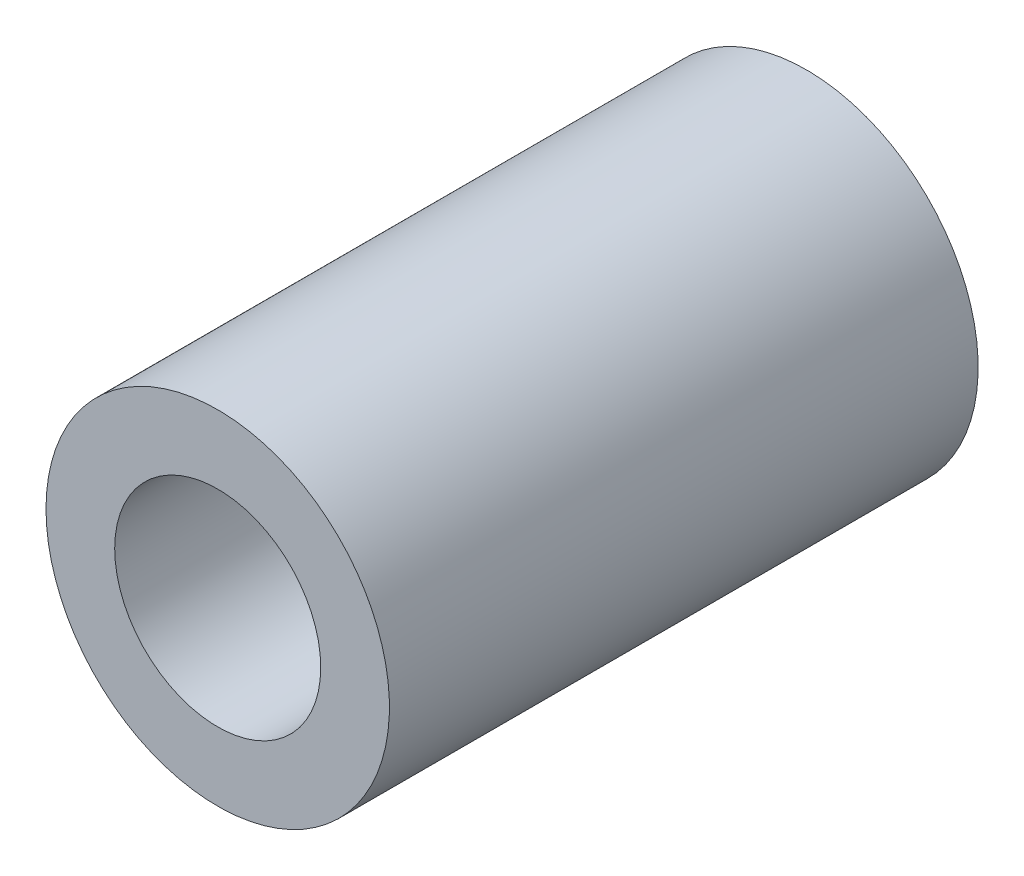
ISO-10303-21;
HEADER;
FILE_DESCRIPTION(('STEP AP214'),'2;1');
FILE_NAME('part.step','',(''),(''),'','','');
FILE_SCHEMA(('AUTOMOTIVE_DESIGN { 1 0 10303 214 1 1 1 1 }'));
ENDSEC;
DATA;
#1=APPLICATION_CONTEXT('core data for automotive mechanical design processes');
#2=APPLICATION_PROTOCOL_DEFINITION('international standard','automotive_design',2000,#1);
#3=PRODUCT_CONTEXT('',#1,'mechanical');
#4=PRODUCT('Part','Part','',(#3));
#5=PRODUCT_RELATED_PRODUCT_CATEGORY('part','',(#4));
#6=PRODUCT_DEFINITION_FORMATION('','',#4);
#7=PRODUCT_DEFINITION_CONTEXT('part definition',#1,'design');
#8=PRODUCT_DEFINITION('design','',#6,#7);
#9=PRODUCT_DEFINITION_SHAPE('','',#8);
#10=(LENGTH_UNIT() NAMED_UNIT(*) SI_UNIT(.MILLI.,.METRE.));
#11=(NAMED_UNIT(*) PLANE_ANGLE_UNIT() SI_UNIT($,.RADIAN.));
#12=(NAMED_UNIT(*) SI_UNIT($,.STERADIAN.) SOLID_ANGLE_UNIT());
#13=UNCERTAINTY_MEASURE_WITH_UNIT(LENGTH_MEASURE(1.E-05),#10,'distance_accuracy_value','');
#14=(GEOMETRIC_REPRESENTATION_CONTEXT(3) GLOBAL_UNCERTAINTY_ASSIGNED_CONTEXT((#13)) GLOBAL_UNIT_ASSIGNED_CONTEXT((#10,
#11,#12)) REPRESENTATION_CONTEXT('',''));
#15=CARTESIAN_POINT('',(0.,0.,0.));
#16=DIRECTION('',(0.,0.,1.));
#17=DIRECTION('',(1.,0.,0.));
#18=AXIS2_PLACEMENT_3D('',#15,#16,#17);
#19=CARTESIAN_POINT('',(4.2,0.,0.));
#20=DIRECTION('',(0.,0.,-1.));
#21=DIRECTION('',(-1.,0.,0.));
#22=AXIS2_PLACEMENT_3D('',#19,#20,#21);
#23=PLANE('',#22);
#24=CARTESIAN_POINT('',(0.,0.,0.));
#25=DIRECTION('',(0.,0.,-1.));
#26=DIRECTION('',(-1.,0.,0.));
#27=AXIS2_PLACEMENT_3D('',#24,#25,#26);
#28=CIRCLE('',#27,7.);
#29=CARTESIAN_POINT('',(-7.,0.,0.));
#30=VERTEX_POINT('',#29);
#31=EDGE_CURVE('E10',#30,#30,#28,.T.);
#32=ORIENTED_EDGE('',*,*,#31,.T.);
#33=EDGE_LOOP('',(#32));
#34=FACE_BOUND('',#33,.T.);
#35=CARTESIAN_POINT('',(0.,0.,0.));
#36=DIRECTION('',(0.,0.,-1.));
#37=DIRECTION('',(-1.,0.,0.));
#38=AXIS2_PLACEMENT_3D('',#35,#36,#37);
#39=CIRCLE('',#38,4.2);
#40=CARTESIAN_POINT('',(-4.2,0.,0.));
#41=VERTEX_POINT('',#40);
#42=EDGE_CURVE('E42',#41,#41,#39,.T.);
#43=ORIENTED_EDGE('',*,*,#42,.F.);
#44=EDGE_LOOP('',(#43));
#45=FACE_BOUND('',#44,.T.);
#46=ADVANCED_FACE('F28',(#34,#45),#23,.T.);
#47=CARTESIAN_POINT('',(0.,0.,24.));
#48=DIRECTION('',(0.,0.,-1.));
#49=DIRECTION('',(-1.,0.,0.));
#50=AXIS2_PLACEMENT_3D('',#47,#48,#49);
#51=CYLINDRICAL_SURFACE('',#50,7.);
#52=CARTESIAN_POINT('',(0.,0.,24.));
#53=DIRECTION('',(0.,0.,-1.));
#54=DIRECTION('',(-1.,0.,0.));
#55=AXIS2_PLACEMENT_3D('',#52,#53,#54);
#56=CIRCLE('',#55,7.);
#57=CARTESIAN_POINT('',(-7.,0.,24.));
#58=VERTEX_POINT('',#57);
#59=EDGE_CURVE('E34',#58,#58,#56,.T.);
#60=ORIENTED_EDGE('',*,*,#59,.T.);
#61=EDGE_LOOP('',(#60));
#62=FACE_BOUND('',#61,.T.);
#63=ORIENTED_EDGE('',*,*,#31,.F.);
#64=EDGE_LOOP('',(#63));
#65=FACE_BOUND('',#64,.T.);
#66=ADVANCED_FACE('F52',(#62,#65),#51,.T.);
#67=CARTESIAN_POINT('',(7.,0.,24.));
#68=DIRECTION('',(0.,0.,1.));
#69=DIRECTION('',(1.,0.,0.));
#70=AXIS2_PLACEMENT_3D('',#67,#68,#69);
#71=PLANE('',#70);
#72=CARTESIAN_POINT('',(0.,0.,24.));
#73=DIRECTION('',(0.,0.,-1.));
#74=DIRECTION('',(-1.,0.,0.));
#75=AXIS2_PLACEMENT_3D('',#72,#73,#74);
#76=CIRCLE('',#75,4.2);
#77=CARTESIAN_POINT('',(-4.2,0.,24.));
#78=VERTEX_POINT('',#77);
#79=EDGE_CURVE('E38',#78,#78,#76,.T.);
#80=ORIENTED_EDGE('',*,*,#79,.T.);
#81=EDGE_LOOP('',(#80));
#82=FACE_BOUND('',#81,.T.);
#83=ORIENTED_EDGE('',*,*,#59,.F.);
#84=EDGE_LOOP('',(#83));
#85=FACE_BOUND('',#84,.T.);
#86=ADVANCED_FACE('F56',(#82,#85),#71,.T.);
#87=CARTESIAN_POINT('',(0.,0.,24.));
#88=DIRECTION('',(0.,0.,-1.));
#89=DIRECTION('',(-1.,0.,0.));
#90=AXIS2_PLACEMENT_3D('',#87,#88,#89);
#91=CYLINDRICAL_SURFACE('',#90,4.2);
#92=ORIENTED_EDGE('',*,*,#42,.T.);
#93=EDGE_LOOP('',(#92));
#94=FACE_BOUND('',#93,.T.);
#95=ORIENTED_EDGE('',*,*,#79,.F.);
#96=EDGE_LOOP('',(#95));
#97=FACE_BOUND('',#96,.T.);
#98=ADVANCED_FACE('F48',(#94,#97),#91,.F.);
#99=CLOSED_SHELL('',(#46,#66,#86,#98));
#100=MANIFOLD_SOLID_BREP('B2',#99);
#101=ADVANCED_BREP_SHAPE_REPRESENTATION('',(#18,#100),#14);
#102=SHAPE_DEFINITION_REPRESENTATION(#9,#101);
ENDSEC;
END-ISO-10303-21;
